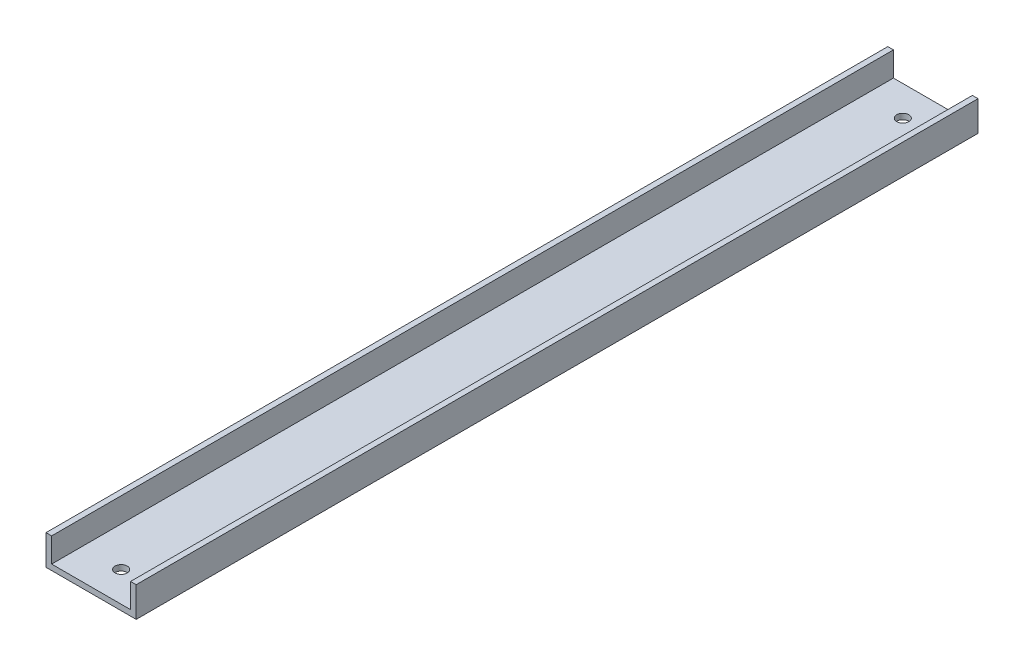
ISO-10303-21;
HEADER;
FILE_DESCRIPTION(('STEP AP214'),'2;1');
FILE_NAME('part.step','',(''),(''),'','','');
FILE_SCHEMA(('AUTOMOTIVE_DESIGN { 1 0 10303 214 1 1 1 1 }'));
ENDSEC;
DATA;
#1=APPLICATION_CONTEXT('core data for automotive mechanical design processes');
#2=APPLICATION_PROTOCOL_DEFINITION('international standard','automotive_design',2000,#1);
#3=PRODUCT_CONTEXT('',#1,'mechanical');
#4=PRODUCT('Part','Part','',(#3));
#5=PRODUCT_RELATED_PRODUCT_CATEGORY('part','',(#4));
#6=PRODUCT_DEFINITION_FORMATION('','',#4);
#7=PRODUCT_DEFINITION_CONTEXT('part definition',#1,'design');
#8=PRODUCT_DEFINITION('design','',#6,#7);
#9=PRODUCT_DEFINITION_SHAPE('','',#8);
#10=(LENGTH_UNIT() NAMED_UNIT(*) SI_UNIT(.MILLI.,.METRE.));
#11=(NAMED_UNIT(*) PLANE_ANGLE_UNIT() SI_UNIT($,.RADIAN.));
#12=(NAMED_UNIT(*) SI_UNIT($,.STERADIAN.) SOLID_ANGLE_UNIT());
#13=UNCERTAINTY_MEASURE_WITH_UNIT(LENGTH_MEASURE(1.E-05),#10,'distance_accuracy_value','');
#14=(GEOMETRIC_REPRESENTATION_CONTEXT(3) GLOBAL_UNCERTAINTY_ASSIGNED_CONTEXT((#13)) GLOBAL_UNIT_ASSIGNED_CONTEXT((#10,
#11,#12)) REPRESENTATION_CONTEXT('',''));
#15=CARTESIAN_POINT('',(0.,0.,0.));
#16=DIRECTION('',(0.,0.,1.));
#17=DIRECTION('',(1.,0.,0.));
#18=AXIS2_PLACEMENT_3D('',#15,#16,#17);
#19=CARTESIAN_POINT('',(-16.66875,2.38125,177.8));
#20=DIRECTION('',(-1.,0.,0.));
#21=DIRECTION('',(0.,0.,1.));
#22=AXIS2_PLACEMENT_3D('',#19,#20,#21);
#23=PLANE('',#22);
#24=DIRECTION('',(0.,1.,0.));
#25=VECTOR('',#24,1.);
#26=CARTESIAN_POINT('',(-16.66875,2.38125,-177.8));
#27=LINE('',#26,#25);
#28=CARTESIAN_POINT('',(-16.66875,2.38125,-177.8));
#29=VERTEX_POINT('',#28);
#30=CARTESIAN_POINT('',(-16.66875,12.7,-177.8));
#31=VERTEX_POINT('',#30);
#32=EDGE_CURVE('E142',#29,#31,#27,.T.);
#33=ORIENTED_EDGE('',*,*,#32,.T.);
#34=DIRECTION('',(0.,0.,-1.));
#35=VECTOR('',#34,1.);
#36=CARTESIAN_POINT('',(-16.66875,12.7,177.8));
#37=LINE('',#36,#35);
#38=CARTESIAN_POINT('',(-16.66875,12.7,177.8));
#39=VERTEX_POINT('',#38);
#40=EDGE_CURVE('E11',#39,#31,#37,.T.);
#41=ORIENTED_EDGE('',*,*,#40,.F.);
#42=DIRECTION('',(0.,1.,0.));
#43=VECTOR('',#42,1.);
#44=CARTESIAN_POINT('',(-16.66875,2.38125,177.8));
#45=LINE('',#44,#43);
#46=CARTESIAN_POINT('',(-16.66875,2.38125,177.8));
#47=VERTEX_POINT('',#46);
#48=EDGE_CURVE('E165',#47,#39,#45,.T.);
#49=ORIENTED_EDGE('',*,*,#48,.F.);
#50=DIRECTION('',(0.,0.,-1.));
#51=VECTOR('',#50,1.);
#52=CARTESIAN_POINT('',(-16.66875,2.38125,177.8));
#53=LINE('',#52,#51);
#54=EDGE_CURVE('E138',#47,#29,#53,.T.);
#55=ORIENTED_EDGE('',*,*,#54,.T.);
#56=EDGE_LOOP('',(#33,#41,#49,#55));
#57=FACE_BOUND('',#56,.T.);
#58=ADVANCED_FACE('F41',(#57),#23,.F.);
#59=CARTESIAN_POINT('',(-16.66875,12.7,177.8));
#60=DIRECTION('',(0.,-1.,0.));
#61=DIRECTION('',(1.,0.,0.));
#62=AXIS2_PLACEMENT_3D('',#59,#60,#61);
#63=PLANE('',#62);
#64=DIRECTION('',(-1.,0.,0.));
#65=VECTOR('',#64,1.);
#66=CARTESIAN_POINT('',(-16.66875,12.7,-177.8));
#67=LINE('',#66,#65);
#68=CARTESIAN_POINT('',(-19.05,12.7,-177.8));
#69=VERTEX_POINT('',#68);
#70=EDGE_CURVE('E146',#31,#69,#67,.T.);
#71=ORIENTED_EDGE('',*,*,#70,.T.);
#72=DIRECTION('',(0.,0.,-1.));
#73=VECTOR('',#72,1.);
#74=CARTESIAN_POINT('',(-19.05,12.7,177.8));
#75=LINE('',#74,#73);
#76=CARTESIAN_POINT('',(-19.05,12.7,177.8));
#77=VERTEX_POINT('',#76);
#78=EDGE_CURVE('E50',#77,#69,#75,.T.);
#79=ORIENTED_EDGE('',*,*,#78,.F.);
#80=DIRECTION('',(-1.,0.,0.));
#81=VECTOR('',#80,1.);
#82=CARTESIAN_POINT('',(-16.66875,12.7,177.8));
#83=LINE('',#82,#81);
#84=EDGE_CURVE('E101',#39,#77,#83,.T.);
#85=ORIENTED_EDGE('',*,*,#84,.F.);
#86=ORIENTED_EDGE('',*,*,#40,.T.);
#87=EDGE_LOOP('',(#71,#79,#85,#86));
#88=FACE_BOUND('',#87,.T.);
#89=ADVANCED_FACE('F247',(#88),#63,.F.);
#90=CARTESIAN_POINT('',(-19.05,12.7,177.8));
#91=DIRECTION('',(1.,0.,0.));
#92=DIRECTION('',(0.,1.,0.));
#93=AXIS2_PLACEMENT_3D('',#90,#91,#92);
#94=PLANE('',#93);
#95=DIRECTION('',(0.,-1.,0.));
#96=VECTOR('',#95,1.);
#97=CARTESIAN_POINT('',(-19.05,12.7,-177.8));
#98=LINE('',#97,#96);
#99=CARTESIAN_POINT('',(-19.05,0.,-177.8));
#100=VERTEX_POINT('',#99);
#101=EDGE_CURVE('E150',#69,#100,#98,.T.);
#102=ORIENTED_EDGE('',*,*,#101,.T.);
#103=DIRECTION('',(0.,0.,-1.));
#104=VECTOR('',#103,1.);
#105=CARTESIAN_POINT('',(-19.05,0.,177.8));
#106=LINE('',#105,#104);
#107=CARTESIAN_POINT('',(-19.05,0.,177.8));
#108=VERTEX_POINT('',#107);
#109=EDGE_CURVE('E176',#108,#100,#106,.T.);
#110=ORIENTED_EDGE('',*,*,#109,.F.);
#111=DIRECTION('',(0.,-1.,0.));
#112=VECTOR('',#111,1.);
#113=CARTESIAN_POINT('',(-19.05,12.7,177.8));
#114=LINE('',#113,#112);
#115=EDGE_CURVE('E186',#77,#108,#114,.T.);
#116=ORIENTED_EDGE('',*,*,#115,.F.);
#117=ORIENTED_EDGE('',*,*,#78,.T.);
#118=EDGE_LOOP('',(#102,#110,#116,#117));
#119=FACE_BOUND('',#118,.T.);
#120=ADVANCED_FACE('F184',(#119),#94,.F.);
#121=CARTESIAN_POINT('',(-19.05,0.,177.8));
#122=DIRECTION('',(0.,1.,0.));
#123=DIRECTION('',(0.,0.,1.));
#124=AXIS2_PLACEMENT_3D('',#121,#122,#123);
#125=PLANE('',#124);
#126=CARTESIAN_POINT('',(0.,0.,-165.1));
#127=DIRECTION('',(0.,1.,0.));
#128=DIRECTION('',(0.,0.,1.));
#129=AXIS2_PLACEMENT_3D('',#126,#127,#128);
#130=CIRCLE('',#129,2.5527);
#131=CARTESIAN_POINT('',(0.,0.,-162.5473));
#132=VERTEX_POINT('',#131);
#133=EDGE_CURVE('E216',#132,#132,#130,.T.);
#134=ORIENTED_EDGE('',*,*,#133,.T.);
#135=EDGE_LOOP('',(#134));
#136=FACE_BOUND('',#135,.T.);
#137=CARTESIAN_POINT('',(0.,0.,165.1));
#138=DIRECTION('',(0.,1.,0.));
#139=DIRECTION('',(0.,0.,1.));
#140=AXIS2_PLACEMENT_3D('',#137,#138,#139);
#141=CIRCLE('',#140,2.5527);
#142=CARTESIAN_POINT('',(0.,0.,167.6527));
#143=VERTEX_POINT('',#142);
#144=EDGE_CURVE('E147',#143,#143,#141,.T.);
#145=ORIENTED_EDGE('',*,*,#144,.T.);
#146=EDGE_LOOP('',(#145));
#147=FACE_BOUND('',#146,.T.);
#148=DIRECTION('',(1.,0.,0.));
#149=VECTOR('',#148,1.);
#150=CARTESIAN_POINT('',(-19.05,0.,-177.8));
#151=LINE('',#150,#149);
#152=CARTESIAN_POINT('',(19.05,0.,-177.8));
#153=VERTEX_POINT('',#152);
#154=EDGE_CURVE('E153',#100,#153,#151,.T.);
#155=ORIENTED_EDGE('',*,*,#154,.T.);
#156=DIRECTION('',(0.,0.,-1.));
#157=VECTOR('',#156,1.);
#158=CARTESIAN_POINT('',(19.05,0.,177.8));
#159=LINE('',#158,#157);
#160=CARTESIAN_POINT('',(19.05,0.,177.8));
#161=VERTEX_POINT('',#160);
#162=EDGE_CURVE('E172',#161,#153,#159,.T.);
#163=ORIENTED_EDGE('',*,*,#162,.F.);
#164=DIRECTION('',(1.,0.,0.));
#165=VECTOR('',#164,1.);
#166=CARTESIAN_POINT('',(-19.05,0.,177.8));
#167=LINE('',#166,#165);
#168=EDGE_CURVE('E199',#108,#161,#167,.T.);
#169=ORIENTED_EDGE('',*,*,#168,.F.);
#170=ORIENTED_EDGE('',*,*,#109,.T.);
#171=EDGE_LOOP('',(#155,#163,#169,#170));
#172=FACE_BOUND('',#171,.T.);
#173=ADVANCED_FACE('F194',(#136,#147,#172),#125,.F.);
#174=CARTESIAN_POINT('',(19.05,0.,177.8));
#175=DIRECTION('',(-1.,0.,0.));
#176=DIRECTION('',(0.,-1.,0.));
#177=AXIS2_PLACEMENT_3D('',#174,#175,#176);
#178=PLANE('',#177);
#179=DIRECTION('',(0.,1.,0.));
#180=VECTOR('',#179,1.);
#181=CARTESIAN_POINT('',(19.05,0.,-177.8));
#182=LINE('',#181,#180);
#183=CARTESIAN_POINT('',(19.05,12.7,-177.8));
#184=VERTEX_POINT('',#183);
#185=EDGE_CURVE('E156',#153,#184,#182,.T.);
#186=ORIENTED_EDGE('',*,*,#185,.T.);
#187=DIRECTION('',(0.,0.,-1.));
#188=VECTOR('',#187,1.);
#189=CARTESIAN_POINT('',(19.05,12.7,177.8));
#190=LINE('',#189,#188);
#191=CARTESIAN_POINT('',(19.05,12.7,177.8));
#192=VERTEX_POINT('',#191);
#193=EDGE_CURVE('E131',#192,#184,#190,.T.);
#194=ORIENTED_EDGE('',*,*,#193,.F.);
#195=DIRECTION('',(0.,1.,0.));
#196=VECTOR('',#195,1.);
#197=CARTESIAN_POINT('',(19.05,0.,177.8));
#198=LINE('',#197,#196);
#199=EDGE_CURVE('E120',#161,#192,#198,.T.);
#200=ORIENTED_EDGE('',*,*,#199,.F.);
#201=ORIENTED_EDGE('',*,*,#162,.T.);
#202=EDGE_LOOP('',(#186,#194,#200,#201));
#203=FACE_BOUND('',#202,.T.);
#204=ADVANCED_FACE('F197',(#203),#178,.F.);
#205=CARTESIAN_POINT('',(19.05,12.7,177.8));
#206=DIRECTION('',(0.,-1.,0.));
#207=DIRECTION('',(1.,0.,0.));
#208=AXIS2_PLACEMENT_3D('',#205,#206,#207);
#209=PLANE('',#208);
#210=DIRECTION('',(-1.,0.,0.));
#211=VECTOR('',#210,1.);
#212=CARTESIAN_POINT('',(19.05,12.7,-177.8));
#213=LINE('',#212,#211);
#214=CARTESIAN_POINT('',(16.66875,12.7,-177.8));
#215=VERTEX_POINT('',#214);
#216=EDGE_CURVE('E129',#184,#215,#213,.T.);
#217=ORIENTED_EDGE('',*,*,#216,.T.);
#218=DIRECTION('',(0.,0.,-1.));
#219=VECTOR('',#218,1.);
#220=CARTESIAN_POINT('',(16.66875,12.7,177.8));
#221=LINE('',#220,#219);
#222=CARTESIAN_POINT('',(16.66875,12.7,177.8));
#223=VERTEX_POINT('',#222);
#224=EDGE_CURVE('E126',#223,#215,#221,.T.);
#225=ORIENTED_EDGE('',*,*,#224,.F.);
#226=DIRECTION('',(-1.,0.,0.));
#227=VECTOR('',#226,1.);
#228=CARTESIAN_POINT('',(19.05,12.7,177.8));
#229=LINE('',#228,#227);
#230=EDGE_CURVE('E114',#192,#223,#229,.T.);
#231=ORIENTED_EDGE('',*,*,#230,.F.);
#232=ORIENTED_EDGE('',*,*,#193,.T.);
#233=EDGE_LOOP('',(#217,#225,#231,#232));
#234=FACE_BOUND('',#233,.T.);
#235=ADVANCED_FACE('F127',(#234),#209,.F.);
#236=CARTESIAN_POINT('',(16.66875,12.7,177.8));
#237=DIRECTION('',(1.,0.,0.));
#238=DIRECTION('',(0.,0.,-1.));
#239=AXIS2_PLACEMENT_3D('',#236,#237,#238);
#240=PLANE('',#239);
#241=DIRECTION('',(0.,-1.,0.));
#242=VECTOR('',#241,1.);
#243=CARTESIAN_POINT('',(16.66875,12.7,-177.8));
#244=LINE('',#243,#242);
#245=CARTESIAN_POINT('',(16.66875,2.38125,-177.8));
#246=VERTEX_POINT('',#245);
#247=EDGE_CURVE('E87',#215,#246,#244,.T.);
#248=ORIENTED_EDGE('',*,*,#247,.T.);
#249=DIRECTION('',(0.,0.,-1.));
#250=VECTOR('',#249,1.);
#251=CARTESIAN_POINT('',(16.66875,2.38125,177.8));
#252=LINE('',#251,#250);
#253=CARTESIAN_POINT('',(16.66875,2.38125,177.8));
#254=VERTEX_POINT('',#253);
#255=EDGE_CURVE('E132',#254,#246,#252,.T.);
#256=ORIENTED_EDGE('',*,*,#255,.F.);
#257=DIRECTION('',(0.,-1.,0.));
#258=VECTOR('',#257,1.);
#259=CARTESIAN_POINT('',(16.66875,12.7,177.8));
#260=LINE('',#259,#258);
#261=EDGE_CURVE('E118',#223,#254,#260,.T.);
#262=ORIENTED_EDGE('',*,*,#261,.F.);
#263=ORIENTED_EDGE('',*,*,#224,.T.);
#264=EDGE_LOOP('',(#248,#256,#262,#263));
#265=FACE_BOUND('',#264,.T.);
#266=ADVANCED_FACE('F134',(#265),#240,.F.);
#267=CARTESIAN_POINT('',(16.66875,2.38125,177.8));
#268=DIRECTION('',(0.,-1.,0.));
#269=DIRECTION('',(0.,0.,-1.));
#270=AXIS2_PLACEMENT_3D('',#267,#268,#269);
#271=PLANE('',#270);
#272=CARTESIAN_POINT('',(0.,2.38125,-165.1));
#273=DIRECTION('',(0.,1.,0.));
#274=DIRECTION('',(0.,0.,1.));
#275=AXIS2_PLACEMENT_3D('',#272,#273,#274);
#276=CIRCLE('',#275,2.5527);
#277=CARTESIAN_POINT('',(0.,2.38125,-162.5473));
#278=VERTEX_POINT('',#277);
#279=EDGE_CURVE('E220',#278,#278,#276,.T.);
#280=ORIENTED_EDGE('',*,*,#279,.F.);
#281=EDGE_LOOP('',(#280));
#282=FACE_BOUND('',#281,.T.);
#283=CARTESIAN_POINT('',(0.,2.38125,165.1));
#284=DIRECTION('',(0.,1.,0.));
#285=DIRECTION('',(0.,0.,1.));
#286=AXIS2_PLACEMENT_3D('',#283,#284,#285);
#287=CIRCLE('',#286,2.5527);
#288=CARTESIAN_POINT('',(0.,2.38125,167.6527));
#289=VERTEX_POINT('',#288);
#290=EDGE_CURVE('E212',#289,#289,#287,.T.);
#291=ORIENTED_EDGE('',*,*,#290,.F.);
#292=EDGE_LOOP('',(#291));
#293=FACE_BOUND('',#292,.T.);
#294=DIRECTION('',(-1.,0.,0.));
#295=VECTOR('',#294,1.);
#296=CARTESIAN_POINT('',(16.66875,2.38125,-177.8));
#297=LINE('',#296,#295);
#298=EDGE_CURVE('E93',#246,#29,#297,.T.);
#299=ORIENTED_EDGE('',*,*,#298,.T.);
#300=ORIENTED_EDGE('',*,*,#54,.F.);
#301=DIRECTION('',(-1.,0.,0.));
#302=VECTOR('',#301,1.);
#303=CARTESIAN_POINT('',(16.66875,2.38125,177.8));
#304=LINE('',#303,#302);
#305=EDGE_CURVE('E58',#254,#47,#304,.T.);
#306=ORIENTED_EDGE('',*,*,#305,.F.);
#307=ORIENTED_EDGE('',*,*,#255,.T.);
#308=EDGE_LOOP('',(#299,#300,#306,#307));
#309=FACE_BOUND('',#308,.T.);
#310=ADVANCED_FACE('F227',(#282,#293,#309),#271,.F.);
#311=CARTESIAN_POINT('',(0.,0.,177.8));
#312=DIRECTION('',(0.,0.,1.));
#313=DIRECTION('',(1.,0.,0.));
#314=AXIS2_PLACEMENT_3D('',#311,#312,#313);
#315=PLANE('',#314);
#316=ORIENTED_EDGE('',*,*,#48,.T.);
#317=ORIENTED_EDGE('',*,*,#84,.T.);
#318=ORIENTED_EDGE('',*,*,#115,.T.);
#319=ORIENTED_EDGE('',*,*,#168,.T.);
#320=ORIENTED_EDGE('',*,*,#199,.T.);
#321=ORIENTED_EDGE('',*,*,#230,.T.);
#322=ORIENTED_EDGE('',*,*,#261,.T.);
#323=ORIENTED_EDGE('',*,*,#305,.T.);
#324=EDGE_LOOP('',(#316,#317,#318,#319,#320,#321,#322,#323));
#325=FACE_BOUND('',#324,.T.);
#326=ADVANCED_FACE('F116',(#325),#315,.T.);
#327=CARTESIAN_POINT('',(0.,0.,-177.8));
#328=DIRECTION('',(0.,0.,1.));
#329=DIRECTION('',(1.,0.,0.));
#330=AXIS2_PLACEMENT_3D('',#327,#328,#329);
#331=PLANE('',#330);
#332=ORIENTED_EDGE('',*,*,#32,.F.);
#333=ORIENTED_EDGE('',*,*,#298,.F.);
#334=ORIENTED_EDGE('',*,*,#247,.F.);
#335=ORIENTED_EDGE('',*,*,#216,.F.);
#336=ORIENTED_EDGE('',*,*,#185,.F.);
#337=ORIENTED_EDGE('',*,*,#154,.F.);
#338=ORIENTED_EDGE('',*,*,#101,.F.);
#339=ORIENTED_EDGE('',*,*,#70,.F.);
#340=EDGE_LOOP('',(#332,#333,#334,#335,#336,#337,#338,#339));
#341=FACE_BOUND('',#340,.T.);
#342=ADVANCED_FACE('F190',(#341),#331,.F.);
#343=CARTESIAN_POINT('',(0.,2.38125,165.1));
#344=DIRECTION('',(0.,1.,0.));
#345=DIRECTION('',(0.,0.,1.));
#346=AXIS2_PLACEMENT_3D('',#343,#344,#345);
#347=CYLINDRICAL_SURFACE('',#346,2.5527);
#348=ORIENTED_EDGE('',*,*,#144,.F.);
#349=EDGE_LOOP('',(#348));
#350=FACE_BOUND('',#349,.T.);
#351=ORIENTED_EDGE('',*,*,#290,.T.);
#352=EDGE_LOOP('',(#351));
#353=FACE_BOUND('',#352,.T.);
#354=ADVANCED_FACE('F233',(#350,#353),#347,.F.);
#355=CARTESIAN_POINT('',(0.,2.38125,-165.1));
#356=DIRECTION('',(0.,1.,0.));
#357=DIRECTION('',(0.,0.,1.));
#358=AXIS2_PLACEMENT_3D('',#355,#356,#357);
#359=CYLINDRICAL_SURFACE('',#358,2.5527);
#360=ORIENTED_EDGE('',*,*,#133,.F.);
#361=EDGE_LOOP('',(#360));
#362=FACE_BOUND('',#361,.T.);
#363=ORIENTED_EDGE('',*,*,#279,.T.);
#364=EDGE_LOOP('',(#363));
#365=FACE_BOUND('',#364,.T.);
#366=ADVANCED_FACE('F225',(#362,#365),#359,.F.);
#367=CLOSED_SHELL('',(#58,#89,#120,#173,#204,#235,#266,#310,#326,#342,#354,#366));
#368=MANIFOLD_SOLID_BREP('B2',#367);
#369=ADVANCED_BREP_SHAPE_REPRESENTATION('',(#18,#368),#14);
#370=SHAPE_DEFINITION_REPRESENTATION(#9,#369);
ENDSEC;
END-ISO-10303-21;
